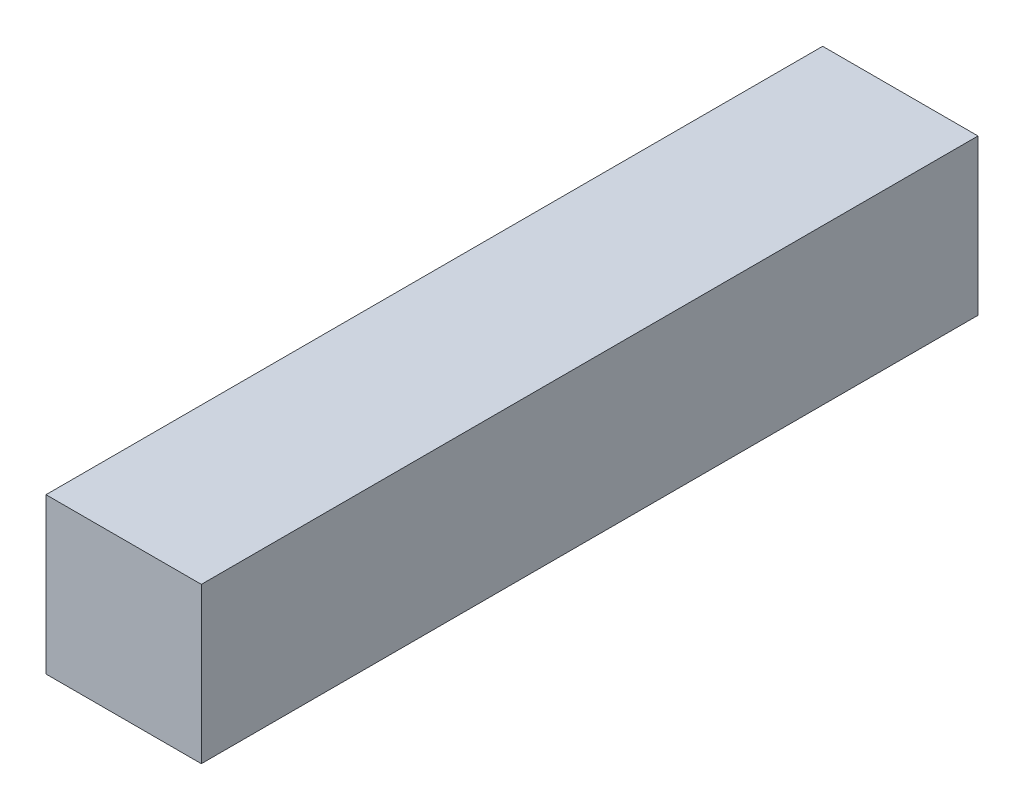
ISO-10303-21;
HEADER;
FILE_DESCRIPTION(('STEP AP214'),'2;1');
FILE_NAME('part.step','',(''),(''),'','','');
FILE_SCHEMA(('AUTOMOTIVE_DESIGN { 1 0 10303 214 1 1 1 1 }'));
ENDSEC;
DATA;
#1=APPLICATION_CONTEXT('core data for automotive mechanical design processes');
#2=APPLICATION_PROTOCOL_DEFINITION('international standard','automotive_design',2000,#1);
#3=PRODUCT_CONTEXT('',#1,'mechanical');
#4=PRODUCT('Part','Part','',(#3));
#5=PRODUCT_RELATED_PRODUCT_CATEGORY('part','',(#4));
#6=PRODUCT_DEFINITION_FORMATION('','',#4);
#7=PRODUCT_DEFINITION_CONTEXT('part definition',#1,'design');
#8=PRODUCT_DEFINITION('design','',#6,#7);
#9=PRODUCT_DEFINITION_SHAPE('','',#8);
#10=(LENGTH_UNIT() NAMED_UNIT(*) SI_UNIT(.MILLI.,.METRE.));
#11=(NAMED_UNIT(*) PLANE_ANGLE_UNIT() SI_UNIT($,.RADIAN.));
#12=(NAMED_UNIT(*) SI_UNIT($,.STERADIAN.) SOLID_ANGLE_UNIT());
#13=UNCERTAINTY_MEASURE_WITH_UNIT(LENGTH_MEASURE(1.E-05),#10,'distance_accuracy_value','');
#14=(GEOMETRIC_REPRESENTATION_CONTEXT(3) GLOBAL_UNCERTAINTY_ASSIGNED_CONTEXT((#13)) GLOBAL_UNIT_ASSIGNED_CONTEXT((#10,
#11,#12)) REPRESENTATION_CONTEXT('',''));
#15=CARTESIAN_POINT('',(0.,0.,0.));
#16=DIRECTION('',(0.,0.,1.));
#17=DIRECTION('',(1.,0.,0.));
#18=AXIS2_PLACEMENT_3D('',#15,#16,#17);
#19=CARTESIAN_POINT('',(1000.,-1000.,10000.));
#20=DIRECTION('',(-1.,0.,0.));
#21=DIRECTION('',(0.,0.,1.));
#22=AXIS2_PLACEMENT_3D('',#19,#20,#21);
#23=PLANE('',#22);
#24=DIRECTION('',(0.,1.,0.));
#25=VECTOR('',#24,1.);
#26=CARTESIAN_POINT('',(1000.,-1000.,0.));
#27=LINE('',#26,#25);
#28=CARTESIAN_POINT('',(1000.,-1000.,0.));
#29=VERTEX_POINT('',#28);
#30=CARTESIAN_POINT('',(1000.,1000.,0.));
#31=VERTEX_POINT('',#30);
#32=EDGE_CURVE('E106',#29,#31,#27,.T.);
#33=ORIENTED_EDGE('',*,*,#32,.T.);
#34=DIRECTION('',(0.,0.,-1.));
#35=VECTOR('',#34,1.);
#36=CARTESIAN_POINT('',(1000.,1000.,10000.));
#37=LINE('',#36,#35);
#38=CARTESIAN_POINT('',(1000.,1000.,10000.));
#39=VERTEX_POINT('',#38);
#40=EDGE_CURVE('E11',#39,#31,#37,.T.);
#41=ORIENTED_EDGE('',*,*,#40,.F.);
#42=DIRECTION('',(0.,1.,0.));
#43=VECTOR('',#42,1.);
#44=CARTESIAN_POINT('',(1000.,-1000.,10000.));
#45=LINE('',#44,#43);
#46=CARTESIAN_POINT('',(1000.,-1000.,10000.));
#47=VERTEX_POINT('',#46);
#48=EDGE_CURVE('E94',#47,#39,#45,.T.);
#49=ORIENTED_EDGE('',*,*,#48,.F.);
#50=DIRECTION('',(0.,0.,-1.));
#51=VECTOR('',#50,1.);
#52=CARTESIAN_POINT('',(1000.,-1000.,10000.));
#53=LINE('',#52,#51);
#54=EDGE_CURVE('E102',#47,#29,#53,.T.);
#55=ORIENTED_EDGE('',*,*,#54,.T.);
#56=EDGE_LOOP('',(#33,#41,#49,#55));
#57=FACE_BOUND('',#56,.T.);
#58=ADVANCED_FACE('F43',(#57),#23,.F.);
#59=CARTESIAN_POINT('',(-1000.,1000.,10000.));
#60=DIRECTION('',(0.,-1.,0.));
#61=DIRECTION('',(0.,0.,-1.));
#62=AXIS2_PLACEMENT_3D('',#59,#60,#61);
#63=PLANE('',#62);
#64=DIRECTION('',(-1.,0.,0.));
#65=VECTOR('',#64,1.);
#66=CARTESIAN_POINT('',(-1000.,1000.,0.));
#67=LINE('',#66,#65);
#68=CARTESIAN_POINT('',(-1000.,1000.,0.));
#69=VERTEX_POINT('',#68);
#70=EDGE_CURVE('E98',#31,#69,#67,.T.);
#71=ORIENTED_EDGE('',*,*,#70,.T.);
#72=DIRECTION('',(0.,0.,-1.));
#73=VECTOR('',#72,1.);
#74=CARTESIAN_POINT('',(-1000.,1000.,10000.));
#75=LINE('',#74,#73);
#76=CARTESIAN_POINT('',(-1000.,1000.,10000.));
#77=VERTEX_POINT('',#76);
#78=EDGE_CURVE('E51',#77,#69,#75,.T.);
#79=ORIENTED_EDGE('',*,*,#78,.F.);
#80=DIRECTION('',(-1.,0.,0.));
#81=VECTOR('',#80,1.);
#82=CARTESIAN_POINT('',(-1000.,1000.,10000.));
#83=LINE('',#82,#81);
#84=EDGE_CURVE('E89',#39,#77,#83,.T.);
#85=ORIENTED_EDGE('',*,*,#84,.F.);
#86=ORIENTED_EDGE('',*,*,#40,.T.);
#87=EDGE_LOOP('',(#71,#79,#85,#86));
#88=FACE_BOUND('',#87,.T.);
#89=ADVANCED_FACE('F97',(#88),#63,.F.);
#90=CARTESIAN_POINT('',(-1000.,-1000.,10000.));
#91=DIRECTION('',(1.,0.,0.));
#92=DIRECTION('',(0.,0.,-1.));
#93=AXIS2_PLACEMENT_3D('',#90,#91,#92);
#94=PLANE('',#93);
#95=DIRECTION('',(0.,-1.,0.));
#96=VECTOR('',#95,1.);
#97=CARTESIAN_POINT('',(-1000.,-1000.,0.));
#98=LINE('',#97,#96);
#99=CARTESIAN_POINT('',(-1000.,-1000.,0.));
#100=VERTEX_POINT('',#99);
#101=EDGE_CURVE('E76',#69,#100,#98,.T.);
#102=ORIENTED_EDGE('',*,*,#101,.T.);
#103=DIRECTION('',(0.,0.,-1.));
#104=VECTOR('',#103,1.);
#105=CARTESIAN_POINT('',(-1000.,-1000.,10000.));
#106=LINE('',#105,#104);
#107=CARTESIAN_POINT('',(-1000.,-1000.,10000.));
#108=VERTEX_POINT('',#107);
#109=EDGE_CURVE('E99',#108,#100,#106,.T.);
#110=ORIENTED_EDGE('',*,*,#109,.F.);
#111=DIRECTION('',(0.,-1.,0.));
#112=VECTOR('',#111,1.);
#113=CARTESIAN_POINT('',(-1000.,-1000.,10000.));
#114=LINE('',#113,#112);
#115=EDGE_CURVE('E92',#77,#108,#114,.T.);
#116=ORIENTED_EDGE('',*,*,#115,.F.);
#117=ORIENTED_EDGE('',*,*,#78,.T.);
#118=EDGE_LOOP('',(#102,#110,#116,#117));
#119=FACE_BOUND('',#118,.T.);
#120=ADVANCED_FACE('F100',(#119),#94,.F.);
#121=CARTESIAN_POINT('',(-1000.,-1000.,10000.));
#122=DIRECTION('',(0.,1.,0.));
#123=DIRECTION('',(0.,0.,1.));
#124=AXIS2_PLACEMENT_3D('',#121,#122,#123);
#125=PLANE('',#124);
#126=DIRECTION('',(1.,0.,0.));
#127=VECTOR('',#126,1.);
#128=CARTESIAN_POINT('',(-1000.,-1000.,0.));
#129=LINE('',#128,#127);
#130=EDGE_CURVE('E82',#100,#29,#129,.T.);
#131=ORIENTED_EDGE('',*,*,#130,.T.);
#132=ORIENTED_EDGE('',*,*,#54,.F.);
#133=DIRECTION('',(1.,0.,0.));
#134=VECTOR('',#133,1.);
#135=CARTESIAN_POINT('',(-1000.,-1000.,10000.));
#136=LINE('',#135,#134);
#137=EDGE_CURVE('E59',#108,#47,#136,.T.);
#138=ORIENTED_EDGE('',*,*,#137,.F.);
#139=ORIENTED_EDGE('',*,*,#109,.T.);
#140=EDGE_LOOP('',(#131,#132,#138,#139));
#141=FACE_BOUND('',#140,.T.);
#142=ADVANCED_FACE('F113',(#141),#125,.F.);
#143=CARTESIAN_POINT('',(0.,0.,10000.));
#144=DIRECTION('',(0.,0.,-1.));
#145=DIRECTION('',(-1.,0.,0.));
#146=AXIS2_PLACEMENT_3D('',#143,#144,#145);
#147=PLANE('',#146);
#148=ORIENTED_EDGE('',*,*,#48,.T.);
#149=ORIENTED_EDGE('',*,*,#84,.T.);
#150=ORIENTED_EDGE('',*,*,#115,.T.);
#151=ORIENTED_EDGE('',*,*,#137,.T.);
#152=EDGE_LOOP('',(#148,#149,#150,#151));
#153=FACE_BOUND('',#152,.T.);
#154=ADVANCED_FACE('F90',(#153),#147,.F.);
#155=CARTESIAN_POINT('',(0.,0.,0.));
#156=DIRECTION('',(0.,0.,-1.));
#157=DIRECTION('',(-1.,0.,0.));
#158=AXIS2_PLACEMENT_3D('',#155,#156,#157);
#159=PLANE('',#158);
#160=ORIENTED_EDGE('',*,*,#32,.F.);
#161=ORIENTED_EDGE('',*,*,#130,.F.);
#162=ORIENTED_EDGE('',*,*,#101,.F.);
#163=ORIENTED_EDGE('',*,*,#70,.F.);
#164=EDGE_LOOP('',(#160,#161,#162,#163));
#165=FACE_BOUND('',#164,.T.);
#166=ADVANCED_FACE('F116',(#165),#159,.T.);
#167=CLOSED_SHELL('',(#58,#89,#120,#142,#154,#166));
#168=MANIFOLD_SOLID_BREP('B2',#167);
#169=ADVANCED_BREP_SHAPE_REPRESENTATION('',(#18,#168),#14);
#170=SHAPE_DEFINITION_REPRESENTATION(#9,#169);
ENDSEC;
END-ISO-10303-21;
